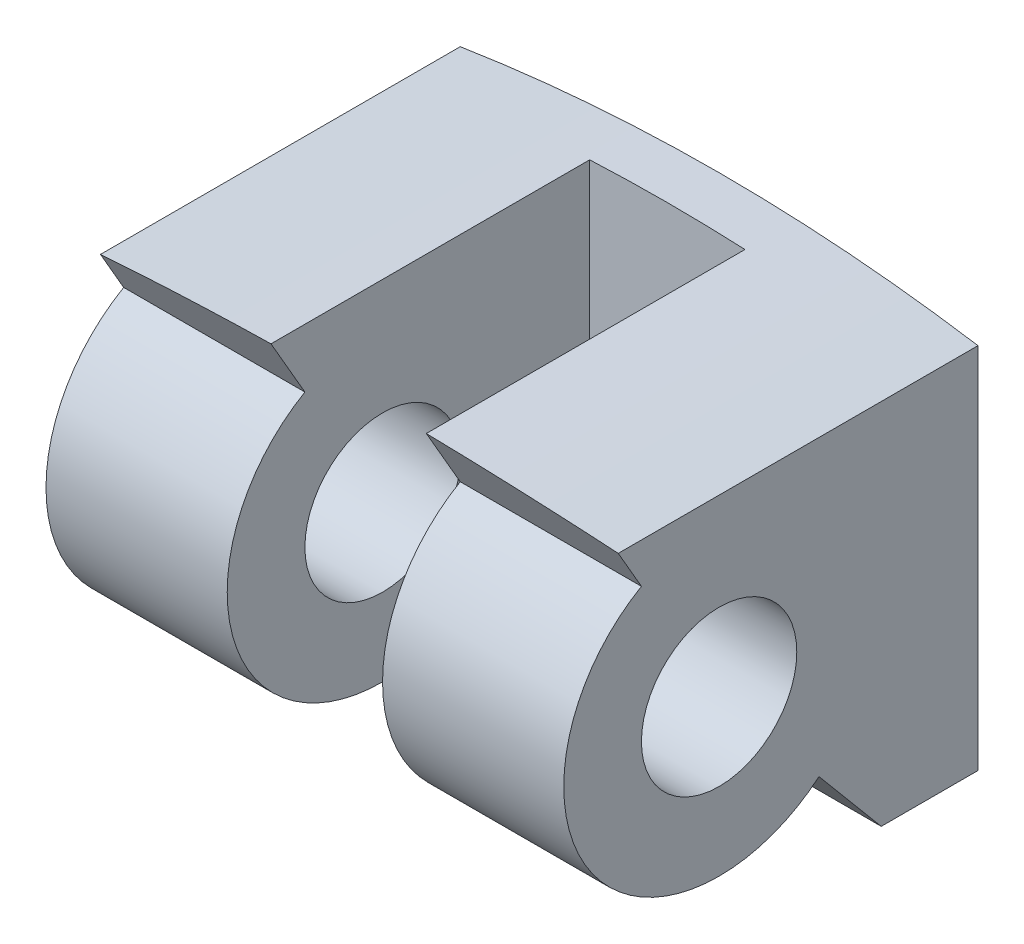
ISO-10303-21;
HEADER;
FILE_DESCRIPTION(('STEP AP214'),'2;1');
FILE_NAME('part.step','',(''),(''),'','','');
FILE_SCHEMA(('AUTOMOTIVE_DESIGN { 1 0 10303 214 1 1 1 1 }'));
ENDSEC;
DATA;
#1=APPLICATION_CONTEXT('core data for automotive mechanical design processes');
#2=APPLICATION_PROTOCOL_DEFINITION('international standard','automotive_design',2000,#1);
#3=PRODUCT_CONTEXT('',#1,'mechanical');
#4=PRODUCT('Part','Part','',(#3));
#5=PRODUCT_RELATED_PRODUCT_CATEGORY('part','',(#4));
#6=PRODUCT_DEFINITION_FORMATION('','',#4);
#7=PRODUCT_DEFINITION_CONTEXT('part definition',#1,'design');
#8=PRODUCT_DEFINITION('design','',#6,#7);
#9=PRODUCT_DEFINITION_SHAPE('','',#8);
#10=(LENGTH_UNIT() NAMED_UNIT(*) SI_UNIT(.MILLI.,.METRE.));
#11=(NAMED_UNIT(*) PLANE_ANGLE_UNIT() SI_UNIT($,.RADIAN.));
#12=(NAMED_UNIT(*) SI_UNIT($,.STERADIAN.) SOLID_ANGLE_UNIT());
#13=UNCERTAINTY_MEASURE_WITH_UNIT(LENGTH_MEASURE(1.E-05),#10,'distance_accuracy_value','');
#14=(GEOMETRIC_REPRESENTATION_CONTEXT(3) GLOBAL_UNCERTAINTY_ASSIGNED_CONTEXT((#13)) GLOBAL_UNIT_ASSIGNED_CONTEXT((#10,
#11,#12)) REPRESENTATION_CONTEXT('',''));
#15=CARTESIAN_POINT('',(0.,0.,0.));
#16=DIRECTION('',(0.,0.,1.));
#17=DIRECTION('',(1.,0.,0.));
#18=AXIS2_PLACEMENT_3D('',#15,#16,#17);
#19=CARTESIAN_POINT('',(-5.,31.6069612585582,8.));
#20=DIRECTION('',(1.,0.,0.));
#21=DIRECTION('',(0.,0.,-1.));
#22=AXIS2_PLACEMENT_3D('',#19,#20,#21);
#23=PLANE('',#22);
#24=CARTESIAN_POINT('',(-5.,28.2324122084246,5.));
#25=DIRECTION('',(1.,0.,0.));
#26=DIRECTION('',(0.,0.,-1.));
#27=AXIS2_PLACEMENT_3D('',#24,#25,#26);
#28=CIRCLE('',#27,1.5);
#29=CARTESIAN_POINT('',(-5.,28.2324122084246,3.5));
#30=VERTEX_POINT('',#29);
#31=EDGE_CURVE('E198',#30,#30,#28,.F.);
#32=ORIENTED_EDGE('',*,*,#31,.F.);
#33=EDGE_LOOP('',(#32));
#34=FACE_BOUND('',#33,.T.);
#35=DIRECTION('',(0.,-0.766044443118975,-0.642787609686543));
#36=VECTOR('',#35,1.);
#37=CARTESIAN_POINT('',(-5.,32.0626344240195,8.21393804843272));
#38=LINE('',#37,#36);
#39=CARTESIAN_POINT('',(-5.,25.9342788790677,3.07163717094038));
#40=VERTEX_POINT('',#39);
#41=CARTESIAN_POINT('',(-5.,24.5,1.8681342925093));
#42=VERTEX_POINT('',#41);
#43=EDGE_CURVE('E173',#40,#42,#38,.T.);
#44=ORIENTED_EDGE('',*,*,#43,.F.);
#45=CARTESIAN_POINT('',(-5.,28.2324122084246,5.));
#46=DIRECTION('',(-1.,0.,0.));
#47=DIRECTION('',(0.,0.,1.));
#48=AXIS2_PLACEMENT_3D('',#45,#46,#47);
#49=CIRCLE('',#48,3.);
#50=CARTESIAN_POINT('',(-5.,30.8304884197779,6.5));
#51=VERTEX_POINT('',#50);
#52=EDGE_CURVE('E141',#40,#51,#49,.T.);
#53=ORIENTED_EDGE('',*,*,#52,.T.);
#54=DIRECTION('',(0.,0.86602540378444,0.499999999999998));
#55=VECTOR('',#54,1.);
#56=CARTESIAN_POINT('',(-5.,23.9022851895024,2.50000000000001));
#57=LINE('',#56,#55);
#58=CARTESIAN_POINT('',(-5.,31.6069612585582,6.94829680248823));
#59=VERTEX_POINT('',#58);
#60=EDGE_CURVE('E147',#51,#59,#57,.T.);
#61=ORIENTED_EDGE('',*,*,#60,.T.);
#62=DIRECTION('',(0.,0.,-1.));
#63=VECTOR('',#62,1.);
#64=CARTESIAN_POINT('',(-5.,31.6069612585582,8.));
#65=LINE('',#64,#63);
#66=CARTESIAN_POINT('',(-5.,31.6069612585582,0.));
#67=VERTEX_POINT('',#66);
#68=EDGE_CURVE('E259',#59,#67,#65,.T.);
#69=ORIENTED_EDGE('',*,*,#68,.T.);
#70=DIRECTION('',(0.,-1.,0.));
#71=VECTOR('',#70,1.);
#72=CARTESIAN_POINT('',(-5.,31.6069612585582,0.));
#73=LINE('',#72,#71);
#74=CARTESIAN_POINT('',(-5.,24.5,0.));
#75=VERTEX_POINT('',#74);
#76=EDGE_CURVE('E240',#67,#75,#73,.T.);
#77=ORIENTED_EDGE('',*,*,#76,.T.);
#78=DIRECTION('',(0.,0.,-1.));
#79=VECTOR('',#78,1.);
#80=CARTESIAN_POINT('',(-5.,24.5,8.));
#81=LINE('',#80,#79);
#82=EDGE_CURVE('E256',#42,#75,#81,.T.);
#83=ORIENTED_EDGE('',*,*,#82,.F.);
#84=EDGE_LOOP('',(#44,#53,#61,#69,#77,#83));
#85=FACE_BOUND('',#84,.T.);
#86=ADVANCED_FACE('F38',(#34,#85),#23,.F.);
#87=CARTESIAN_POINT('',(-5.,24.5,8.));
#88=DIRECTION('',(0.,1.,0.));
#89=DIRECTION('',(0.,0.,1.));
#90=AXIS2_PLACEMENT_3D('',#87,#88,#89);
#91=PLANE('',#90);
#92=DIRECTION('',(1.,0.,0.));
#93=VECTOR('',#92,1.);
#94=CARTESIAN_POINT('',(-5.,24.5,1.8681342925093));
#95=LINE('',#94,#93);
#96=CARTESIAN_POINT('',(-1.5,24.5,1.8681342925093));
#97=VERTEX_POINT('',#96);
#98=EDGE_CURVE('E189',#42,#97,#95,.T.);
#99=ORIENTED_EDGE('',*,*,#98,.F.);
#100=ORIENTED_EDGE('',*,*,#82,.T.);
#101=DIRECTION('',(1.,0.,0.));
#102=VECTOR('',#101,1.);
#103=CARTESIAN_POINT('',(-5.,24.5,0.));
#104=LINE('',#103,#102);
#105=CARTESIAN_POINT('',(5.,24.5,0.));
#106=VERTEX_POINT('',#105);
#107=EDGE_CURVE('E244',#75,#106,#104,.T.);
#108=ORIENTED_EDGE('',*,*,#107,.T.);
#109=DIRECTION('',(0.,0.,-1.));
#110=VECTOR('',#109,1.);
#111=CARTESIAN_POINT('',(5.,24.5,8.));
#112=LINE('',#111,#110);
#113=CARTESIAN_POINT('',(5.,24.5,1.8681342925093));
#114=VERTEX_POINT('',#113);
#115=EDGE_CURVE('E253',#114,#106,#112,.T.);
#116=ORIENTED_EDGE('',*,*,#115,.F.);
#117=CARTESIAN_POINT('',(1.5,24.5,1.8681342925093));
#118=VERTEX_POINT('',#117);
#119=EDGE_CURVE('E185',#118,#114,#95,.T.);
#120=ORIENTED_EDGE('',*,*,#119,.F.);
#121=DIRECTION('',(0.,0.,1.));
#122=VECTOR('',#121,1.);
#123=CARTESIAN_POINT('',(1.5,24.5,1.));
#124=LINE('',#123,#122);
#125=CARTESIAN_POINT('',(1.5,24.5,1.));
#126=VERTEX_POINT('',#125);
#127=EDGE_CURVE('E214',#126,#118,#124,.T.);
#128=ORIENTED_EDGE('',*,*,#127,.F.);
#129=DIRECTION('',(1.,0.,0.));
#130=VECTOR('',#129,1.);
#131=CARTESIAN_POINT('',(1.5,24.5,1.));
#132=LINE('',#131,#130);
#133=CARTESIAN_POINT('',(-1.5,24.5,1.));
#134=VERTEX_POINT('',#133);
#135=EDGE_CURVE('E210',#134,#126,#132,.T.);
#136=ORIENTED_EDGE('',*,*,#135,.F.);
#137=DIRECTION('',(0.,0.,-1.));
#138=VECTOR('',#137,1.);
#139=CARTESIAN_POINT('',(-1.5,24.5,1.));
#140=LINE('',#139,#138);
#141=EDGE_CURVE('E207',#97,#134,#140,.T.);
#142=ORIENTED_EDGE('',*,*,#141,.F.);
#143=EDGE_LOOP('',(#99,#100,#108,#116,#120,#128,#136,#142));
#144=FACE_BOUND('',#143,.T.);
#145=ADVANCED_FACE('F276',(#144),#91,.F.);
#146=CARTESIAN_POINT('',(5.,31.6069612585582,8.));
#147=DIRECTION('',(-1.,0.,0.));
#148=DIRECTION('',(0.,0.,1.));
#149=AXIS2_PLACEMENT_3D('',#146,#147,#148);
#150=PLANE('',#149);
#151=CARTESIAN_POINT('',(5.,28.2324122084246,5.));
#152=DIRECTION('',(-1.,0.,0.));
#153=DIRECTION('',(0.,0.,1.));
#154=AXIS2_PLACEMENT_3D('',#151,#152,#153);
#155=CIRCLE('',#154,1.5);
#156=CARTESIAN_POINT('',(5.,28.2324122084246,6.50000000000001));
#157=VERTEX_POINT('',#156);
#158=EDGE_CURVE('E194',#157,#157,#155,.T.);
#159=ORIENTED_EDGE('',*,*,#158,.T.);
#160=EDGE_LOOP('',(#159));
#161=FACE_BOUND('',#160,.T.);
#162=DIRECTION('',(0.,-0.766044443118975,-0.642787609686543));
#163=VECTOR('',#162,1.);
#164=CARTESIAN_POINT('',(5.,32.0626344240195,8.21393804843272));
#165=LINE('',#164,#163);
#166=CARTESIAN_POINT('',(5.,25.9342788790677,3.07163717094037));
#167=VERTEX_POINT('',#166);
#168=EDGE_CURVE('E167',#167,#114,#165,.T.);
#169=ORIENTED_EDGE('',*,*,#168,.T.);
#170=ORIENTED_EDGE('',*,*,#115,.T.);
#171=DIRECTION('',(0.,1.,0.));
#172=VECTOR('',#171,1.);
#173=CARTESIAN_POINT('',(5.,31.6069612585582,0.));
#174=LINE('',#173,#172);
#175=CARTESIAN_POINT('',(5.,31.6069612585582,0.));
#176=VERTEX_POINT('',#175);
#177=EDGE_CURVE('E248',#106,#176,#174,.T.);
#178=ORIENTED_EDGE('',*,*,#177,.T.);
#179=DIRECTION('',(0.,0.,-1.));
#180=VECTOR('',#179,1.);
#181=CARTESIAN_POINT('',(5.,31.6069612585582,8.));
#182=LINE('',#181,#180);
#183=CARTESIAN_POINT('',(5.,31.6069612585582,6.94829680248823));
#184=VERTEX_POINT('',#183);
#185=EDGE_CURVE('E153',#184,#176,#182,.T.);
#186=ORIENTED_EDGE('',*,*,#185,.F.);
#187=DIRECTION('',(0.,0.86602540378444,0.499999999999998));
#188=VECTOR('',#187,1.);
#189=CARTESIAN_POINT('',(5.,23.9022851895024,2.50000000000001));
#190=LINE('',#189,#188);
#191=CARTESIAN_POINT('',(5.,30.8304884197779,6.5));
#192=VERTEX_POINT('',#191);
#193=EDGE_CURVE('E144',#192,#184,#190,.T.);
#194=ORIENTED_EDGE('',*,*,#193,.F.);
#195=CARTESIAN_POINT('',(5.,28.2324122084246,5.));
#196=DIRECTION('',(-1.,0.,0.));
#197=DIRECTION('',(0.,0.,1.));
#198=AXIS2_PLACEMENT_3D('',#195,#196,#197);
#199=CIRCLE('',#198,3.);
#200=EDGE_CURVE('E129',#167,#192,#199,.T.);
#201=ORIENTED_EDGE('',*,*,#200,.F.);
#202=EDGE_LOOP('',(#169,#170,#178,#186,#194,#201));
#203=FACE_BOUND('',#202,.T.);
#204=ADVANCED_FACE('F151',(#161,#203),#150,.F.);
#205=CARTESIAN_POINT('',(-1.5,34.5,1.));
#206=DIRECTION('',(-1.,0.,0.));
#207=DIRECTION('',(0.,0.,1.));
#208=AXIS2_PLACEMENT_3D('',#205,#206,#207);
#209=PLANE('',#208);
#210=CARTESIAN_POINT('',(-1.5,28.2324122084246,5.));
#211=DIRECTION('',(-1.,0.,0.));
#212=DIRECTION('',(0.,0.,1.));
#213=AXIS2_PLACEMENT_3D('',#210,#211,#212);
#214=CIRCLE('',#213,1.5);
#215=CARTESIAN_POINT('',(-1.5,28.2324122084246,6.5));
#216=VERTEX_POINT('',#215);
#217=EDGE_CURVE('E203',#216,#216,#214,.T.);
#218=ORIENTED_EDGE('',*,*,#217,.T.);
#219=EDGE_LOOP('',(#218));
#220=FACE_BOUND('',#219,.T.);
#221=DIRECTION('',(0.,0.766044443118975,0.642787609686543));
#222=VECTOR('',#221,1.);
#223=CARTESIAN_POINT('',(-1.5,29.9407681973751,6.4334808802479));
#224=LINE('',#223,#222);
#225=CARTESIAN_POINT('',(-1.5,25.9342788790677,3.07163717094037));
#226=VERTEX_POINT('',#225);
#227=EDGE_CURVE('E188',#97,#226,#224,.T.);
#228=ORIENTED_EDGE('',*,*,#227,.F.);
#229=ORIENTED_EDGE('',*,*,#141,.T.);
#230=DIRECTION('',(0.,-1.,0.));
#231=VECTOR('',#230,1.);
#232=CARTESIAN_POINT('',(-1.5,34.5,1.));
#233=LINE('',#232,#231);
#234=CARTESIAN_POINT('',(-1.5,31.9648244168492,1.));
#235=VERTEX_POINT('',#234);
#236=EDGE_CURVE('E218',#235,#134,#233,.T.);
#237=ORIENTED_EDGE('',*,*,#236,.F.);
#238=DIRECTION('',(0.,0.,-1.));
#239=VECTOR('',#238,1.);
#240=CARTESIAN_POINT('',(-1.5,31.9648244168492,8.));
#241=LINE('',#240,#239);
#242=CARTESIAN_POINT('',(-1.5,31.9648244168492,7.15490919326058));
#243=VERTEX_POINT('',#242);
#244=EDGE_CURVE('E229',#243,#235,#241,.T.);
#245=ORIENTED_EDGE('',*,*,#244,.F.);
#246=DIRECTION('',(0.,-0.86602540378444,-0.499999999999998));
#247=VECTOR('',#246,1.);
#248=CARTESIAN_POINT('',(-1.5,31.2010522445373,6.71394512397675));
#249=LINE('',#248,#247);
#250=CARTESIAN_POINT('',(-1.5,30.8304884197779,6.5));
#251=VERTEX_POINT('',#250);
#252=EDGE_CURVE('E180',#243,#251,#249,.T.);
#253=ORIENTED_EDGE('',*,*,#252,.T.);
#254=CARTESIAN_POINT('',(-1.5,28.2324122084246,5.));
#255=DIRECTION('',(-1.,0.,0.));
#256=DIRECTION('',(0.,0.,1.));
#257=AXIS2_PLACEMENT_3D('',#254,#255,#256);
#258=CIRCLE('',#257,3.);
#259=EDGE_CURVE('E54',#251,#226,#258,.F.);
#260=ORIENTED_EDGE('',*,*,#259,.T.);
#261=EDGE_LOOP('',(#228,#229,#237,#245,#253,#260));
#262=FACE_BOUND('',#261,.T.);
#263=ADVANCED_FACE('F297',(#220,#262),#209,.F.);
#264=CARTESIAN_POINT('',(1.5,34.5,1.));
#265=DIRECTION('',(1.,0.,0.));
#266=DIRECTION('',(0.,0.,-1.));
#267=AXIS2_PLACEMENT_3D('',#264,#265,#266);
#268=PLANE('',#267);
#269=CARTESIAN_POINT('',(1.5,28.2324122084246,5.));
#270=DIRECTION('',(1.,0.,0.));
#271=DIRECTION('',(0.,0.,-1.));
#272=AXIS2_PLACEMENT_3D('',#269,#270,#271);
#273=CIRCLE('',#272,1.5);
#274=CARTESIAN_POINT('',(1.5,28.2324122084246,3.5));
#275=VERTEX_POINT('',#274);
#276=EDGE_CURVE('E202',#275,#275,#273,.T.);
#277=ORIENTED_EDGE('',*,*,#276,.T.);
#278=EDGE_LOOP('',(#277));
#279=FACE_BOUND('',#278,.T.);
#280=DIRECTION('',(0.,-0.766044443118975,-0.642787609686543));
#281=VECTOR('',#280,1.);
#282=CARTESIAN_POINT('',(1.5,29.9407681973751,6.4334808802479));
#283=LINE('',#282,#281);
#284=CARTESIAN_POINT('',(1.5,25.9342788790677,3.07163717094037));
#285=VERTEX_POINT('',#284);
#286=EDGE_CURVE('E11',#285,#118,#283,.T.);
#287=ORIENTED_EDGE('',*,*,#286,.F.);
#288=CARTESIAN_POINT('',(1.5,28.2324122084246,5.));
#289=DIRECTION('',(1.,0.,0.));
#290=DIRECTION('',(0.,0.,-1.));
#291=AXIS2_PLACEMENT_3D('',#288,#289,#290);
#292=CIRCLE('',#291,3.);
#293=CARTESIAN_POINT('',(1.5,30.8304884197779,6.5));
#294=VERTEX_POINT('',#293);
#295=EDGE_CURVE('E47',#285,#294,#292,.F.);
#296=ORIENTED_EDGE('',*,*,#295,.T.);
#297=DIRECTION('',(0.,0.86602540378444,0.499999999999998));
#298=VECTOR('',#297,1.);
#299=CARTESIAN_POINT('',(1.5,31.2010522445373,6.71394512397675));
#300=LINE('',#299,#298);
#301=CARTESIAN_POINT('',(1.5,31.9648244168492,7.15490919326058));
#302=VERTEX_POINT('',#301);
#303=EDGE_CURVE('E145',#294,#302,#300,.T.);
#304=ORIENTED_EDGE('',*,*,#303,.T.);
#305=DIRECTION('',(0.,0.,-1.));
#306=VECTOR('',#305,1.);
#307=CARTESIAN_POINT('',(1.5,31.9648244168492,8.));
#308=LINE('',#307,#306);
#309=CARTESIAN_POINT('',(1.5,31.9648244168492,1.));
#310=VERTEX_POINT('',#309);
#311=EDGE_CURVE('E222',#310,#302,#308,.F.);
#312=ORIENTED_EDGE('',*,*,#311,.F.);
#313=DIRECTION('',(0.,-1.,0.));
#314=VECTOR('',#313,1.);
#315=CARTESIAN_POINT('',(1.5,34.5,1.));
#316=LINE('',#315,#314);
#317=EDGE_CURVE('E219',#310,#126,#316,.T.);
#318=ORIENTED_EDGE('',*,*,#317,.T.);
#319=ORIENTED_EDGE('',*,*,#127,.T.);
#320=EDGE_LOOP('',(#287,#296,#304,#312,#318,#319));
#321=FACE_BOUND('',#320,.T.);
#322=ADVANCED_FACE('F269',(#279,#321),#268,.F.);
#323=CARTESIAN_POINT('',(0.,0.,8.));
#324=DIRECTION('',(0.,0.,-1.));
#325=DIRECTION('',(-1.,0.,0.));
#326=AXIS2_PLACEMENT_3D('',#323,#324,#325);
#327=CYLINDRICAL_SURFACE('',#326,32.);
#328=ORIENTED_EDGE('',*,*,#68,.F.);
#329=CARTESIAN_POINT('',(0.,0.,-11.2999907884063));
#330=DIRECTION('',(0.,0.499999999999998,-0.86602540378444));
#331=DIRECTION('',(0.,-0.86602540378444,-0.499999999999998));
#332=AXIS2_PLACEMENT_3D('',#329,#330,#331);
#333=ELLIPSE('',#332,36.950417228136,32.);
#334=EDGE_CURVE('E181',#59,#243,#333,.T.);
#335=ORIENTED_EDGE('',*,*,#334,.T.);
#336=ORIENTED_EDGE('',*,*,#244,.T.);
#337=CARTESIAN_POINT('',(0.,0.,1.));
#338=DIRECTION('',(0.,0.,-1.));
#339=DIRECTION('',(-1.,0.,0.));
#340=AXIS2_PLACEMENT_3D('',#337,#338,#339);
#341=CIRCLE('',#340,32.);
#342=EDGE_CURVE('E232',#235,#310,#341,.T.);
#343=ORIENTED_EDGE('',*,*,#342,.T.);
#344=ORIENTED_EDGE('',*,*,#311,.T.);
#345=EDGE_CURVE('E62',#302,#184,#333,.T.);
#346=ORIENTED_EDGE('',*,*,#345,.T.);
#347=ORIENTED_EDGE('',*,*,#185,.T.);
#348=CARTESIAN_POINT('',(0.,0.,0.));
#349=DIRECTION('',(0.,0.,1.));
#350=DIRECTION('',(-1.,0.,0.));
#351=AXIS2_PLACEMENT_3D('',#348,#349,#350);
#352=CIRCLE('',#351,32.);
#353=EDGE_CURVE('E236',#176,#67,#352,.T.);
#354=ORIENTED_EDGE('',*,*,#353,.T.);
#355=EDGE_LOOP('',(#328,#335,#336,#343,#344,#346,#347,#354));
#356=FACE_BOUND('',#355,.T.);
#357=ADVANCED_FACE('F40',(#356),#327,.T.);
#358=CARTESIAN_POINT('',(0.,0.,0.));
#359=DIRECTION('',(0.,0.,-1.));
#360=DIRECTION('',(-1.,0.,0.));
#361=AXIS2_PLACEMENT_3D('',#358,#359,#360);
#362=PLANE('',#361);
#363=CARTESIAN_POINT('',(0.,29.,0.));
#364=DIRECTION('',(0.,0.,-1.));
#365=DIRECTION('',(-1.,0.,0.));
#366=AXIS2_PLACEMENT_3D('',#363,#364,#365);
#367=CIRCLE('',#366,0.5);
#368=CARTESIAN_POINT('',(-0.5,29.,0.));
#369=VERTEX_POINT('',#368);
#370=EDGE_CURVE('E155',#369,#369,#367,.T.);
#371=ORIENTED_EDGE('',*,*,#370,.F.);
#372=EDGE_LOOP('',(#371));
#373=FACE_BOUND('',#372,.T.);
#374=ORIENTED_EDGE('',*,*,#353,.F.);
#375=ORIENTED_EDGE('',*,*,#177,.F.);
#376=ORIENTED_EDGE('',*,*,#107,.F.);
#377=ORIENTED_EDGE('',*,*,#76,.F.);
#378=EDGE_LOOP('',(#374,#375,#376,#377));
#379=FACE_BOUND('',#378,.T.);
#380=ADVANCED_FACE('F284',(#373,#379),#362,.T.);
#381=CARTESIAN_POINT('',(1.5,34.5,1.));
#382=DIRECTION('',(0.,0.,-1.));
#383=DIRECTION('',(-1.,0.,0.));
#384=AXIS2_PLACEMENT_3D('',#381,#382,#383);
#385=PLANE('',#384);
#386=CARTESIAN_POINT('',(0.,29.,1.));
#387=DIRECTION('',(0.,0.,1.));
#388=DIRECTION('',(1.,0.,0.));
#389=AXIS2_PLACEMENT_3D('',#386,#387,#388);
#390=CIRCLE('',#389,0.5);
#391=CARTESIAN_POINT('',(0.5,29.,1.));
#392=VERTEX_POINT('',#391);
#393=EDGE_CURVE('E160',#392,#392,#390,.T.);
#394=ORIENTED_EDGE('',*,*,#393,.F.);
#395=EDGE_LOOP('',(#394));
#396=FACE_BOUND('',#395,.T.);
#397=ORIENTED_EDGE('',*,*,#236,.T.);
#398=ORIENTED_EDGE('',*,*,#135,.T.);
#399=ORIENTED_EDGE('',*,*,#317,.F.);
#400=ORIENTED_EDGE('',*,*,#342,.F.);
#401=EDGE_LOOP('',(#397,#398,#399,#400));
#402=FACE_BOUND('',#401,.T.);
#403=ADVANCED_FACE('F291',(#396,#402),#385,.F.);
#404=CARTESIAN_POINT('',(-9.24264068711929,28.2324122084246,5.));
#405=DIRECTION('',(1.,0.,0.));
#406=DIRECTION('',(0.,0.,-1.));
#407=AXIS2_PLACEMENT_3D('',#404,#405,#406);
#408=CYLINDRICAL_SURFACE('',#407,1.5);
#409=ORIENTED_EDGE('',*,*,#158,.F.);
#410=EDGE_LOOP('',(#409));
#411=FACE_BOUND('',#410,.T.);
#412=ORIENTED_EDGE('',*,*,#276,.F.);
#413=EDGE_LOOP('',(#412));
#414=FACE_BOUND('',#413,.T.);
#415=ADVANCED_FACE('F330',(#411,#414),#408,.F.);
#416=ORIENTED_EDGE('',*,*,#31,.T.);
#417=EDGE_LOOP('',(#416));
#418=FACE_BOUND('',#417,.T.);
#419=ORIENTED_EDGE('',*,*,#217,.F.);
#420=EDGE_LOOP('',(#419));
#421=FACE_BOUND('',#420,.T.);
#422=ADVANCED_FACE('F335',(#418,#421),#408,.F.);
#423=CARTESIAN_POINT('',(0.,32.0626344240195,8.21393804843272));
#424=DIRECTION('',(0.,-0.642787609686543,0.766044443118975));
#425=DIRECTION('',(0.,-0.766044443118975,-0.642787609686543));
#426=AXIS2_PLACEMENT_3D('',#423,#424,#425);
#427=PLANE('',#426);
#428=ORIENTED_EDGE('',*,*,#119,.T.);
#429=ORIENTED_EDGE('',*,*,#168,.F.);
#430=DIRECTION('',(-1.,0.,0.));
#431=VECTOR('',#430,1.);
#432=CARTESIAN_POINT('',(0.,25.9342788790677,3.07163717094037));
#433=LINE('',#432,#431);
#434=EDGE_CURVE('E135',#167,#285,#433,.T.);
#435=ORIENTED_EDGE('',*,*,#434,.T.);
#436=ORIENTED_EDGE('',*,*,#286,.T.);
#437=EDGE_LOOP('',(#428,#429,#435,#436));
#438=FACE_BOUND('',#437,.T.);
#439=ADVANCED_FACE('F271',(#438),#427,.T.);
#440=CARTESIAN_POINT('',(0.,23.9022851895024,2.50000000000001));
#441=DIRECTION('',(0.,0.499999999999998,-0.86602540378444));
#442=DIRECTION('',(0.,0.86602540378444,0.499999999999998));
#443=AXIS2_PLACEMENT_3D('',#440,#441,#442);
#444=PLANE('',#443);
#445=ORIENTED_EDGE('',*,*,#303,.F.);
#446=DIRECTION('',(-1.,0.,0.));
#447=VECTOR('',#446,1.);
#448=CARTESIAN_POINT('',(0.,30.8304884197779,6.5));
#449=LINE('',#448,#447);
#450=EDGE_CURVE('E132',#192,#294,#449,.T.);
#451=ORIENTED_EDGE('',*,*,#450,.F.);
#452=ORIENTED_EDGE('',*,*,#193,.T.);
#453=ORIENTED_EDGE('',*,*,#345,.F.);
#454=EDGE_LOOP('',(#445,#451,#452,#453));
#455=FACE_BOUND('',#454,.T.);
#456=ADVANCED_FACE('F143',(#455),#444,.F.);
#457=CARTESIAN_POINT('',(1.5,28.2324122084246,5.));
#458=DIRECTION('',(-1.,0.,0.));
#459=DIRECTION('',(0.,0.,1.));
#460=AXIS2_PLACEMENT_3D('',#457,#458,#459);
#461=CYLINDRICAL_SURFACE('',#460,3.);
#462=ORIENTED_EDGE('',*,*,#295,.F.);
#463=ORIENTED_EDGE('',*,*,#434,.F.);
#464=ORIENTED_EDGE('',*,*,#200,.T.);
#465=ORIENTED_EDGE('',*,*,#450,.T.);
#466=EDGE_LOOP('',(#462,#463,#464,#465));
#467=FACE_BOUND('',#466,.T.);
#468=ADVANCED_FACE('F131',(#467),#461,.T.);
#469=ORIENTED_EDGE('',*,*,#52,.F.);
#470=EDGE_CURVE('E170',#226,#40,#433,.T.);
#471=ORIENTED_EDGE('',*,*,#470,.F.);
#472=ORIENTED_EDGE('',*,*,#259,.F.);
#473=EDGE_CURVE('E148',#251,#51,#449,.T.);
#474=ORIENTED_EDGE('',*,*,#473,.T.);
#475=EDGE_LOOP('',(#469,#471,#472,#474));
#476=FACE_BOUND('',#475,.T.);
#477=ADVANCED_FACE('F302',(#476),#461,.T.);
#478=ORIENTED_EDGE('',*,*,#98,.T.);
#479=ORIENTED_EDGE('',*,*,#227,.T.);
#480=ORIENTED_EDGE('',*,*,#470,.T.);
#481=ORIENTED_EDGE('',*,*,#43,.T.);
#482=EDGE_LOOP('',(#478,#479,#480,#481));
#483=FACE_BOUND('',#482,.T.);
#484=ADVANCED_FACE('F300',(#483),#427,.T.);
#485=ORIENTED_EDGE('',*,*,#60,.F.);
#486=ORIENTED_EDGE('',*,*,#473,.F.);
#487=ORIENTED_EDGE('',*,*,#252,.F.);
#488=ORIENTED_EDGE('',*,*,#334,.F.);
#489=EDGE_LOOP('',(#485,#486,#487,#488));
#490=FACE_BOUND('',#489,.T.);
#491=ADVANCED_FACE('F309',(#490),#444,.F.);
#492=CARTESIAN_POINT('',(0.,29.,-9.));
#493=DIRECTION('',(0.,0.,1.));
#494=DIRECTION('',(1.,0.,0.));
#495=AXIS2_PLACEMENT_3D('',#492,#493,#494);
#496=CYLINDRICAL_SURFACE('',#495,0.5);
#497=ORIENTED_EDGE('',*,*,#370,.T.);
#498=EDGE_LOOP('',(#497));
#499=FACE_BOUND('',#498,.T.);
#500=ORIENTED_EDGE('',*,*,#393,.T.);
#501=EDGE_LOOP('',(#500));
#502=FACE_BOUND('',#501,.T.);
#503=ADVANCED_FACE('F345',(#499,#502),#496,.F.);
#504=CLOSED_SHELL('',(#86,#145,#204,#263,#322,#357,#380,#403,#415,#422,#439,#456,#468,#477,#484,
#491,#503));
#505=MANIFOLD_SOLID_BREP('B2',#504);
#506=ADVANCED_BREP_SHAPE_REPRESENTATION('',(#18,#505),#14);
#507=SHAPE_DEFINITION_REPRESENTATION(#9,#506);
ENDSEC;
END-ISO-10303-21;
